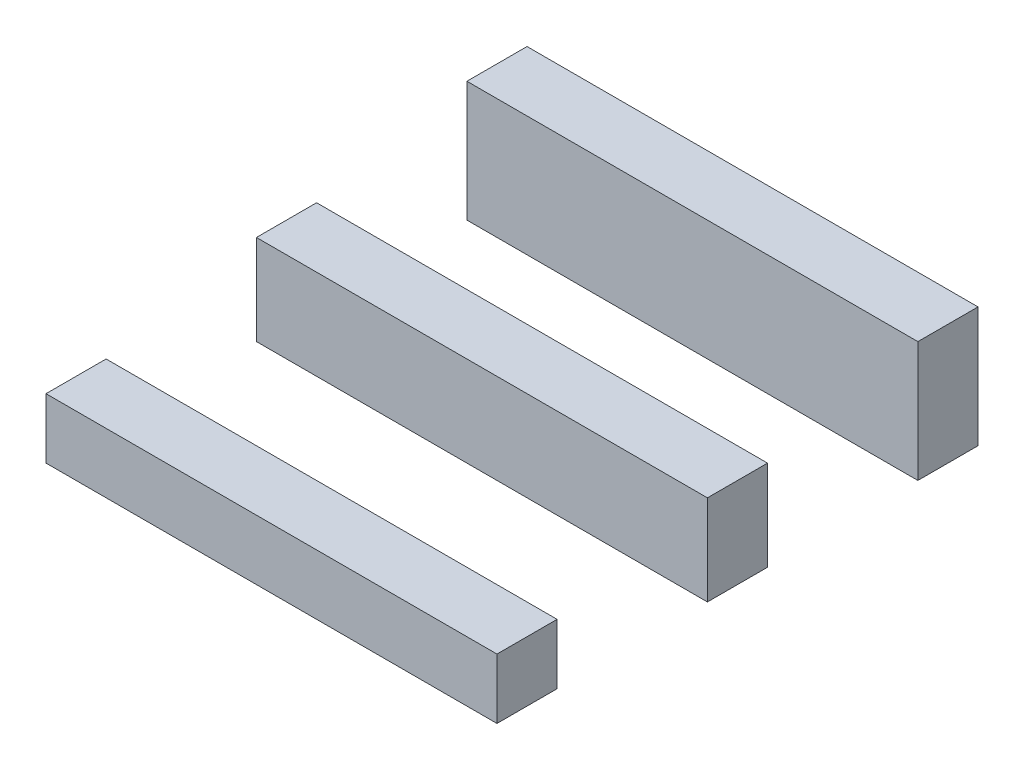
ISO-10303-21;
HEADER;
FILE_DESCRIPTION(('STEP AP214'),'2;1');
FILE_NAME('part.step','',(''),(''),'','','');
FILE_SCHEMA(('AUTOMOTIVE_DESIGN { 1 0 10303 214 1 1 1 1 }'));
ENDSEC;
DATA;
#1=APPLICATION_CONTEXT('core data for automotive mechanical design processes');
#2=APPLICATION_PROTOCOL_DEFINITION('international standard','automotive_design',2000,#1);
#3=PRODUCT_CONTEXT('',#1,'mechanical');
#4=PRODUCT('Part','Part','',(#3));
#5=PRODUCT_RELATED_PRODUCT_CATEGORY('part','',(#4));
#6=PRODUCT_DEFINITION_FORMATION('','',#4);
#7=PRODUCT_DEFINITION_CONTEXT('part definition',#1,'design');
#8=PRODUCT_DEFINITION('design','',#6,#7);
#9=PRODUCT_DEFINITION_SHAPE('','',#8);
#10=(LENGTH_UNIT() NAMED_UNIT(*) SI_UNIT(.MILLI.,.METRE.));
#11=(NAMED_UNIT(*) PLANE_ANGLE_UNIT() SI_UNIT($,.RADIAN.));
#12=(NAMED_UNIT(*) SI_UNIT($,.STERADIAN.) SOLID_ANGLE_UNIT());
#13=UNCERTAINTY_MEASURE_WITH_UNIT(LENGTH_MEASURE(1.E-05),#10,'distance_accuracy_value','');
#14=(GEOMETRIC_REPRESENTATION_CONTEXT(3) GLOBAL_UNCERTAINTY_ASSIGNED_CONTEXT((#13)) GLOBAL_UNIT_ASSIGNED_CONTEXT((#10,
#11,#12)) REPRESENTATION_CONTEXT('',''));
#15=CARTESIAN_POINT('',(0.,0.,0.));
#16=DIRECTION('',(0.,0.,1.));
#17=DIRECTION('',(1.,0.,0.));
#18=AXIS2_PLACEMENT_3D('',#15,#16,#17);
#19=CARTESIAN_POINT('',(-15.,9.,-16.));
#20=DIRECTION('',(1.,0.,0.));
#21=DIRECTION('',(0.,0.,-1.));
#22=AXIS2_PLACEMENT_3D('',#19,#20,#21);
#23=PLANE('',#22);
#24=DIRECTION('',(0.,0.,1.));
#25=VECTOR('',#24,1.);
#26=CARTESIAN_POINT('',(-15.,1.,-16.));
#27=LINE('',#26,#25);
#28=CARTESIAN_POINT('',(-15.,1.,-16.));
#29=VERTEX_POINT('',#28);
#30=CARTESIAN_POINT('',(-15.,1.,-12.));
#31=VERTEX_POINT('',#30);
#32=EDGE_CURVE('E107',#29,#31,#27,.T.);
#33=ORIENTED_EDGE('',*,*,#32,.T.);
#34=DIRECTION('',(0.,-1.,0.));
#35=VECTOR('',#34,1.);
#36=CARTESIAN_POINT('',(-15.,9.,-12.));
#37=LINE('',#36,#35);
#38=CARTESIAN_POINT('',(-15.,9.,-12.));
#39=VERTEX_POINT('',#38);
#40=EDGE_CURVE('E12',#39,#31,#37,.T.);
#41=ORIENTED_EDGE('',*,*,#40,.F.);
#42=DIRECTION('',(0.,0.,1.));
#43=VECTOR('',#42,1.);
#44=CARTESIAN_POINT('',(-15.,9.,-16.));
#45=LINE('',#44,#43);
#46=CARTESIAN_POINT('',(-15.,9.,-16.));
#47=VERTEX_POINT('',#46);
#48=EDGE_CURVE('E95',#47,#39,#45,.T.);
#49=ORIENTED_EDGE('',*,*,#48,.F.);
#50=DIRECTION('',(0.,-1.,0.));
#51=VECTOR('',#50,1.);
#52=CARTESIAN_POINT('',(-15.,9.,-16.));
#53=LINE('',#52,#51);
#54=EDGE_CURVE('E103',#47,#29,#53,.T.);
#55=ORIENTED_EDGE('',*,*,#54,.T.);
#56=EDGE_LOOP('',(#33,#41,#49,#55));
#57=FACE_BOUND('',#56,.T.);
#58=ADVANCED_FACE('F44',(#57),#23,.F.);
#59=CARTESIAN_POINT('',(-15.,9.,-12.));
#60=DIRECTION('',(0.,0.,-1.));
#61=DIRECTION('',(-1.,0.,0.));
#62=AXIS2_PLACEMENT_3D('',#59,#60,#61);
#63=PLANE('',#62);
#64=DIRECTION('',(1.,0.,0.));
#65=VECTOR('',#64,1.);
#66=CARTESIAN_POINT('',(-15.,1.,-12.));
#67=LINE('',#66,#65);
#68=CARTESIAN_POINT('',(15.,1.,-12.));
#69=VERTEX_POINT('',#68);
#70=EDGE_CURVE('E99',#31,#69,#67,.T.);
#71=ORIENTED_EDGE('',*,*,#70,.T.);
#72=DIRECTION('',(0.,-1.,0.));
#73=VECTOR('',#72,1.);
#74=CARTESIAN_POINT('',(15.,9.,-12.));
#75=LINE('',#74,#73);
#76=CARTESIAN_POINT('',(15.,9.,-12.));
#77=VERTEX_POINT('',#76);
#78=EDGE_CURVE('E52',#77,#69,#75,.T.);
#79=ORIENTED_EDGE('',*,*,#78,.F.);
#80=DIRECTION('',(1.,0.,0.));
#81=VECTOR('',#80,1.);
#82=CARTESIAN_POINT('',(-15.,9.,-12.));
#83=LINE('',#82,#81);
#84=EDGE_CURVE('E90',#39,#77,#83,.T.);
#85=ORIENTED_EDGE('',*,*,#84,.F.);
#86=ORIENTED_EDGE('',*,*,#40,.T.);
#87=EDGE_LOOP('',(#71,#79,#85,#86));
#88=FACE_BOUND('',#87,.T.);
#89=ADVANCED_FACE('F98',(#88),#63,.F.);
#90=CARTESIAN_POINT('',(15.,9.,-16.));
#91=DIRECTION('',(-1.,0.,0.));
#92=DIRECTION('',(0.,0.,1.));
#93=AXIS2_PLACEMENT_3D('',#90,#91,#92);
#94=PLANE('',#93);
#95=DIRECTION('',(0.,0.,-1.));
#96=VECTOR('',#95,1.);
#97=CARTESIAN_POINT('',(15.,1.,-16.));
#98=LINE('',#97,#96);
#99=CARTESIAN_POINT('',(15.,1.,-16.));
#100=VERTEX_POINT('',#99);
#101=EDGE_CURVE('E77',#69,#100,#98,.T.);
#102=ORIENTED_EDGE('',*,*,#101,.T.);
#103=DIRECTION('',(0.,-1.,0.));
#104=VECTOR('',#103,1.);
#105=CARTESIAN_POINT('',(15.,9.,-16.));
#106=LINE('',#105,#104);
#107=CARTESIAN_POINT('',(15.,9.,-16.));
#108=VERTEX_POINT('',#107);
#109=EDGE_CURVE('E100',#108,#100,#106,.T.);
#110=ORIENTED_EDGE('',*,*,#109,.F.);
#111=DIRECTION('',(0.,0.,-1.));
#112=VECTOR('',#111,1.);
#113=CARTESIAN_POINT('',(15.,9.,-16.));
#114=LINE('',#113,#112);
#115=EDGE_CURVE('E93',#77,#108,#114,.T.);
#116=ORIENTED_EDGE('',*,*,#115,.F.);
#117=ORIENTED_EDGE('',*,*,#78,.T.);
#118=EDGE_LOOP('',(#102,#110,#116,#117));
#119=FACE_BOUND('',#118,.T.);
#120=ADVANCED_FACE('F101',(#119),#94,.F.);
#121=CARTESIAN_POINT('',(-15.,9.,-16.));
#122=DIRECTION('',(0.,0.,1.));
#123=DIRECTION('',(1.,0.,0.));
#124=AXIS2_PLACEMENT_3D('',#121,#122,#123);
#125=PLANE('',#124);
#126=DIRECTION('',(-1.,0.,0.));
#127=VECTOR('',#126,1.);
#128=CARTESIAN_POINT('',(-15.,1.,-16.));
#129=LINE('',#128,#127);
#130=EDGE_CURVE('E83',#100,#29,#129,.T.);
#131=ORIENTED_EDGE('',*,*,#130,.T.);
#132=ORIENTED_EDGE('',*,*,#54,.F.);
#133=DIRECTION('',(-1.,0.,0.));
#134=VECTOR('',#133,1.);
#135=CARTESIAN_POINT('',(-15.,9.,-16.));
#136=LINE('',#135,#134);
#137=EDGE_CURVE('E60',#108,#47,#136,.T.);
#138=ORIENTED_EDGE('',*,*,#137,.F.);
#139=ORIENTED_EDGE('',*,*,#109,.T.);
#140=EDGE_LOOP('',(#131,#132,#138,#139));
#141=FACE_BOUND('',#140,.T.);
#142=ADVANCED_FACE('F114',(#141),#125,.F.);
#143=CARTESIAN_POINT('',(0.,9.,0.));
#144=DIRECTION('',(0.,1.,0.));
#145=DIRECTION('',(0.,0.,1.));
#146=AXIS2_PLACEMENT_3D('',#143,#144,#145);
#147=PLANE('',#146);
#148=ORIENTED_EDGE('',*,*,#48,.T.);
#149=ORIENTED_EDGE('',*,*,#84,.T.);
#150=ORIENTED_EDGE('',*,*,#115,.T.);
#151=ORIENTED_EDGE('',*,*,#137,.T.);
#152=EDGE_LOOP('',(#148,#149,#150,#151));
#153=FACE_BOUND('',#152,.T.);
#154=ADVANCED_FACE('F91',(#153),#147,.T.);
#155=CARTESIAN_POINT('',(0.,1.,0.));
#156=DIRECTION('',(0.,1.,0.));
#157=DIRECTION('',(0.,0.,1.));
#158=AXIS2_PLACEMENT_3D('',#155,#156,#157);
#159=PLANE('',#158);
#160=ORIENTED_EDGE('',*,*,#32,.F.);
#161=ORIENTED_EDGE('',*,*,#130,.F.);
#162=ORIENTED_EDGE('',*,*,#101,.F.);
#163=ORIENTED_EDGE('',*,*,#70,.F.);
#164=EDGE_LOOP('',(#160,#161,#162,#163));
#165=FACE_BOUND('',#164,.T.);
#166=ADVANCED_FACE('F117',(#165),#159,.F.);
#167=CLOSED_SHELL('',(#58,#89,#120,#142,#154,#166));
#168=MANIFOLD_SOLID_BREP('B2',#167);
#169=CARTESIAN_POINT('',(-15.,7.,-2.00000000000002));
#170=DIRECTION('',(1.,0.,0.));
#171=DIRECTION('',(0.,0.,-1.));
#172=AXIS2_PLACEMENT_3D('',#169,#170,#171);
#173=PLANE('',#172);
#174=DIRECTION('',(0.,0.,1.));
#175=VECTOR('',#174,1.);
#176=CARTESIAN_POINT('',(-15.,1.,-2.00000000000002));
#177=LINE('',#176,#175);
#178=CARTESIAN_POINT('',(-15.,1.,-2.00000000000002));
#179=VERTEX_POINT('',#178);
#180=CARTESIAN_POINT('',(-15.,1.,1.99999999999998));
#181=VERTEX_POINT('',#180);
#182=EDGE_CURVE('E240',#179,#181,#177,.T.);
#183=ORIENTED_EDGE('',*,*,#182,.T.);
#184=DIRECTION('',(0.,-1.,0.));
#185=VECTOR('',#184,1.);
#186=CARTESIAN_POINT('',(-15.,7.,1.99999999999998));
#187=LINE('',#186,#185);
#188=CARTESIAN_POINT('',(-15.,7.,1.99999999999998));
#189=VERTEX_POINT('',#188);
#190=EDGE_CURVE('E42',#189,#181,#187,.T.);
#191=ORIENTED_EDGE('',*,*,#190,.F.);
#192=DIRECTION('',(0.,0.,1.));
#193=VECTOR('',#192,1.);
#194=CARTESIAN_POINT('',(-15.,7.,-2.00000000000002));
#195=LINE('',#194,#193);
#196=CARTESIAN_POINT('',(-15.,7.,-2.00000000000002));
#197=VERTEX_POINT('',#196);
#198=EDGE_CURVE('E228',#197,#189,#195,.T.);
#199=ORIENTED_EDGE('',*,*,#198,.F.);
#200=DIRECTION('',(0.,-1.,0.));
#201=VECTOR('',#200,1.);
#202=CARTESIAN_POINT('',(-15.,7.,-2.00000000000002));
#203=LINE('',#202,#201);
#204=EDGE_CURVE('E236',#197,#179,#203,.T.);
#205=ORIENTED_EDGE('',*,*,#204,.T.);
#206=EDGE_LOOP('',(#183,#191,#199,#205));
#207=FACE_BOUND('',#206,.T.);
#208=ADVANCED_FACE('F177',(#207),#173,.F.);
#209=CARTESIAN_POINT('',(-15.,7.,1.99999999999998));
#210=DIRECTION('',(0.,0.,-1.));
#211=DIRECTION('',(-1.,0.,0.));
#212=AXIS2_PLACEMENT_3D('',#209,#210,#211);
#213=PLANE('',#212);
#214=DIRECTION('',(1.,0.,0.));
#215=VECTOR('',#214,1.);
#216=CARTESIAN_POINT('',(-15.,1.,1.99999999999998));
#217=LINE('',#216,#215);
#218=CARTESIAN_POINT('',(15.,1.,1.99999999999998));
#219=VERTEX_POINT('',#218);
#220=EDGE_CURVE('E232',#181,#219,#217,.T.);
#221=ORIENTED_EDGE('',*,*,#220,.T.);
#222=DIRECTION('',(0.,-1.,0.));
#223=VECTOR('',#222,1.);
#224=CARTESIAN_POINT('',(15.,7.,1.99999999999998));
#225=LINE('',#224,#223);
#226=CARTESIAN_POINT('',(15.,7.,1.99999999999998));
#227=VERTEX_POINT('',#226);
#228=EDGE_CURVE('E185',#227,#219,#225,.T.);
#229=ORIENTED_EDGE('',*,*,#228,.F.);
#230=DIRECTION('',(1.,0.,0.));
#231=VECTOR('',#230,1.);
#232=CARTESIAN_POINT('',(-15.,7.,1.99999999999998));
#233=LINE('',#232,#231);
#234=EDGE_CURVE('E223',#189,#227,#233,.T.);
#235=ORIENTED_EDGE('',*,*,#234,.F.);
#236=ORIENTED_EDGE('',*,*,#190,.T.);
#237=EDGE_LOOP('',(#221,#229,#235,#236));
#238=FACE_BOUND('',#237,.T.);
#239=ADVANCED_FACE('F231',(#238),#213,.F.);
#240=CARTESIAN_POINT('',(15.,7.,-2.00000000000002));
#241=DIRECTION('',(-1.,0.,0.));
#242=DIRECTION('',(0.,0.,1.));
#243=AXIS2_PLACEMENT_3D('',#240,#241,#242);
#244=PLANE('',#243);
#245=DIRECTION('',(0.,0.,-1.));
#246=VECTOR('',#245,1.);
#247=CARTESIAN_POINT('',(15.,1.,-2.00000000000002));
#248=LINE('',#247,#246);
#249=CARTESIAN_POINT('',(15.,1.,-2.00000000000002));
#250=VERTEX_POINT('',#249);
#251=EDGE_CURVE('E210',#219,#250,#248,.T.);
#252=ORIENTED_EDGE('',*,*,#251,.T.);
#253=DIRECTION('',(0.,-1.,0.));
#254=VECTOR('',#253,1.);
#255=CARTESIAN_POINT('',(15.,7.,-2.00000000000002));
#256=LINE('',#255,#254);
#257=CARTESIAN_POINT('',(15.,7.,-2.00000000000002));
#258=VERTEX_POINT('',#257);
#259=EDGE_CURVE('E233',#258,#250,#256,.T.);
#260=ORIENTED_EDGE('',*,*,#259,.F.);
#261=DIRECTION('',(0.,0.,-1.));
#262=VECTOR('',#261,1.);
#263=CARTESIAN_POINT('',(15.,7.,-2.00000000000002));
#264=LINE('',#263,#262);
#265=EDGE_CURVE('E226',#227,#258,#264,.T.);
#266=ORIENTED_EDGE('',*,*,#265,.F.);
#267=ORIENTED_EDGE('',*,*,#228,.T.);
#268=EDGE_LOOP('',(#252,#260,#266,#267));
#269=FACE_BOUND('',#268,.T.);
#270=ADVANCED_FACE('F234',(#269),#244,.F.);
#271=CARTESIAN_POINT('',(-15.,7.,-2.00000000000002));
#272=DIRECTION('',(0.,0.,1.));
#273=DIRECTION('',(1.,0.,0.));
#274=AXIS2_PLACEMENT_3D('',#271,#272,#273);
#275=PLANE('',#274);
#276=DIRECTION('',(-1.,0.,0.));
#277=VECTOR('',#276,1.);
#278=CARTESIAN_POINT('',(-15.,1.,-2.00000000000002));
#279=LINE('',#278,#277);
#280=EDGE_CURVE('E216',#250,#179,#279,.T.);
#281=ORIENTED_EDGE('',*,*,#280,.T.);
#282=ORIENTED_EDGE('',*,*,#204,.F.);
#283=DIRECTION('',(-1.,0.,0.));
#284=VECTOR('',#283,1.);
#285=CARTESIAN_POINT('',(-15.,7.,-2.00000000000002));
#286=LINE('',#285,#284);
#287=EDGE_CURVE('E193',#258,#197,#286,.T.);
#288=ORIENTED_EDGE('',*,*,#287,.F.);
#289=ORIENTED_EDGE('',*,*,#259,.T.);
#290=EDGE_LOOP('',(#281,#282,#288,#289));
#291=FACE_BOUND('',#290,.T.);
#292=ADVANCED_FACE('F247',(#291),#275,.F.);
#293=CARTESIAN_POINT('',(0.,7.,0.));
#294=DIRECTION('',(0.,1.,0.));
#295=DIRECTION('',(0.,0.,1.));
#296=AXIS2_PLACEMENT_3D('',#293,#294,#295);
#297=PLANE('',#296);
#298=ORIENTED_EDGE('',*,*,#198,.T.);
#299=ORIENTED_EDGE('',*,*,#234,.T.);
#300=ORIENTED_EDGE('',*,*,#265,.T.);
#301=ORIENTED_EDGE('',*,*,#287,.T.);
#302=EDGE_LOOP('',(#298,#299,#300,#301));
#303=FACE_BOUND('',#302,.T.);
#304=ADVANCED_FACE('F224',(#303),#297,.T.);
#305=CARTESIAN_POINT('',(0.,1.,0.));
#306=DIRECTION('',(0.,1.,0.));
#307=DIRECTION('',(0.,0.,1.));
#308=AXIS2_PLACEMENT_3D('',#305,#306,#307);
#309=PLANE('',#308);
#310=ORIENTED_EDGE('',*,*,#182,.F.);
#311=ORIENTED_EDGE('',*,*,#280,.F.);
#312=ORIENTED_EDGE('',*,*,#251,.F.);
#313=ORIENTED_EDGE('',*,*,#220,.F.);
#314=EDGE_LOOP('',(#310,#311,#312,#313));
#315=FACE_BOUND('',#314,.T.);
#316=ADVANCED_FACE('F250',(#315),#309,.F.);
#317=CLOSED_SHELL('',(#208,#239,#270,#292,#304,#316));
#318=MANIFOLD_SOLID_BREP('B6',#317);
#319=CARTESIAN_POINT('',(-15.,5.,12.));
#320=DIRECTION('',(1.,0.,0.));
#321=DIRECTION('',(0.,0.,-1.));
#322=AXIS2_PLACEMENT_3D('',#319,#320,#321);
#323=PLANE('',#322);
#324=DIRECTION('',(0.,0.,1.));
#325=VECTOR('',#324,1.);
#326=CARTESIAN_POINT('',(-15.,1.,12.));
#327=LINE('',#326,#325);
#328=CARTESIAN_POINT('',(-15.,1.,12.));
#329=VERTEX_POINT('',#328);
#330=CARTESIAN_POINT('',(-15.,1.,16.));
#331=VERTEX_POINT('',#330);
#332=EDGE_CURVE('E364',#329,#331,#327,.T.);
#333=ORIENTED_EDGE('',*,*,#332,.T.);
#334=DIRECTION('',(0.,-1.,0.));
#335=VECTOR('',#334,1.);
#336=CARTESIAN_POINT('',(-15.,5.,16.));
#337=LINE('',#336,#335);
#338=CARTESIAN_POINT('',(-15.,5.,16.));
#339=VERTEX_POINT('',#338);
#340=EDGE_CURVE('E175',#339,#331,#337,.T.);
#341=ORIENTED_EDGE('',*,*,#340,.F.);
#342=DIRECTION('',(0.,0.,1.));
#343=VECTOR('',#342,1.);
#344=CARTESIAN_POINT('',(-15.,5.,12.));
#345=LINE('',#344,#343);
#346=CARTESIAN_POINT('',(-15.,5.,12.));
#347=VERTEX_POINT('',#346);
#348=EDGE_CURVE('E352',#347,#339,#345,.T.);
#349=ORIENTED_EDGE('',*,*,#348,.F.);
#350=DIRECTION('',(0.,-1.,0.));
#351=VECTOR('',#350,1.);
#352=CARTESIAN_POINT('',(-15.,5.,12.));
#353=LINE('',#352,#351);
#354=EDGE_CURVE('E360',#347,#329,#353,.T.);
#355=ORIENTED_EDGE('',*,*,#354,.T.);
#356=EDGE_LOOP('',(#333,#341,#349,#355));
#357=FACE_BOUND('',#356,.T.);
#358=ADVANCED_FACE('F301',(#357),#323,.F.);
#359=CARTESIAN_POINT('',(-15.,5.,16.));
#360=DIRECTION('',(0.,0.,-1.));
#361=DIRECTION('',(-1.,0.,0.));
#362=AXIS2_PLACEMENT_3D('',#359,#360,#361);
#363=PLANE('',#362);
#364=DIRECTION('',(1.,0.,0.));
#365=VECTOR('',#364,1.);
#366=CARTESIAN_POINT('',(-15.,1.,16.));
#367=LINE('',#366,#365);
#368=CARTESIAN_POINT('',(15.,1.,16.));
#369=VERTEX_POINT('',#368);
#370=EDGE_CURVE('E356',#331,#369,#367,.T.);
#371=ORIENTED_EDGE('',*,*,#370,.T.);
#372=DIRECTION('',(0.,-1.,0.));
#373=VECTOR('',#372,1.);
#374=CARTESIAN_POINT('',(15.,5.,16.));
#375=LINE('',#374,#373);
#376=CARTESIAN_POINT('',(15.,5.,16.));
#377=VERTEX_POINT('',#376);
#378=EDGE_CURVE('E309',#377,#369,#375,.T.);
#379=ORIENTED_EDGE('',*,*,#378,.F.);
#380=DIRECTION('',(1.,0.,0.));
#381=VECTOR('',#380,1.);
#382=CARTESIAN_POINT('',(-15.,5.,16.));
#383=LINE('',#382,#381);
#384=EDGE_CURVE('E347',#339,#377,#383,.T.);
#385=ORIENTED_EDGE('',*,*,#384,.F.);
#386=ORIENTED_EDGE('',*,*,#340,.T.);
#387=EDGE_LOOP('',(#371,#379,#385,#386));
#388=FACE_BOUND('',#387,.T.);
#389=ADVANCED_FACE('F355',(#388),#363,.F.);
#390=CARTESIAN_POINT('',(15.,5.,12.));
#391=DIRECTION('',(-1.,0.,0.));
#392=DIRECTION('',(0.,0.,1.));
#393=AXIS2_PLACEMENT_3D('',#390,#391,#392);
#394=PLANE('',#393);
#395=DIRECTION('',(0.,0.,-1.));
#396=VECTOR('',#395,1.);
#397=CARTESIAN_POINT('',(15.,1.,12.));
#398=LINE('',#397,#396);
#399=CARTESIAN_POINT('',(15.,1.,12.));
#400=VERTEX_POINT('',#399);
#401=EDGE_CURVE('E334',#369,#400,#398,.T.);
#402=ORIENTED_EDGE('',*,*,#401,.T.);
#403=DIRECTION('',(0.,-1.,0.));
#404=VECTOR('',#403,1.);
#405=CARTESIAN_POINT('',(15.,5.,12.));
#406=LINE('',#405,#404);
#407=CARTESIAN_POINT('',(15.,5.,12.));
#408=VERTEX_POINT('',#407);
#409=EDGE_CURVE('E357',#408,#400,#406,.T.);
#410=ORIENTED_EDGE('',*,*,#409,.F.);
#411=DIRECTION('',(0.,0.,-1.));
#412=VECTOR('',#411,1.);
#413=CARTESIAN_POINT('',(15.,5.,12.));
#414=LINE('',#413,#412);
#415=EDGE_CURVE('E350',#377,#408,#414,.T.);
#416=ORIENTED_EDGE('',*,*,#415,.F.);
#417=ORIENTED_EDGE('',*,*,#378,.T.);
#418=EDGE_LOOP('',(#402,#410,#416,#417));
#419=FACE_BOUND('',#418,.T.);
#420=ADVANCED_FACE('F358',(#419),#394,.F.);
#421=CARTESIAN_POINT('',(-15.,5.,12.));
#422=DIRECTION('',(0.,0.,1.));
#423=DIRECTION('',(1.,0.,0.));
#424=AXIS2_PLACEMENT_3D('',#421,#422,#423);
#425=PLANE('',#424);
#426=DIRECTION('',(-1.,0.,0.));
#427=VECTOR('',#426,1.);
#428=CARTESIAN_POINT('',(-15.,1.,12.));
#429=LINE('',#428,#427);
#430=EDGE_CURVE('E340',#400,#329,#429,.T.);
#431=ORIENTED_EDGE('',*,*,#430,.T.);
#432=ORIENTED_EDGE('',*,*,#354,.F.);
#433=DIRECTION('',(-1.,0.,0.));
#434=VECTOR('',#433,1.);
#435=CARTESIAN_POINT('',(-15.,5.,12.));
#436=LINE('',#435,#434);
#437=EDGE_CURVE('E317',#408,#347,#436,.T.);
#438=ORIENTED_EDGE('',*,*,#437,.F.);
#439=ORIENTED_EDGE('',*,*,#409,.T.);
#440=EDGE_LOOP('',(#431,#432,#438,#439));
#441=FACE_BOUND('',#440,.T.);
#442=ADVANCED_FACE('F371',(#441),#425,.F.);
#443=CARTESIAN_POINT('',(0.,5.,0.));
#444=DIRECTION('',(0.,1.,0.));
#445=DIRECTION('',(0.,0.,1.));
#446=AXIS2_PLACEMENT_3D('',#443,#444,#445);
#447=PLANE('',#446);
#448=ORIENTED_EDGE('',*,*,#348,.T.);
#449=ORIENTED_EDGE('',*,*,#384,.T.);
#450=ORIENTED_EDGE('',*,*,#415,.T.);
#451=ORIENTED_EDGE('',*,*,#437,.T.);
#452=EDGE_LOOP('',(#448,#449,#450,#451));
#453=FACE_BOUND('',#452,.T.);
#454=ADVANCED_FACE('F348',(#453),#447,.T.);
#455=CARTESIAN_POINT('',(0.,1.,0.));
#456=DIRECTION('',(0.,1.,0.));
#457=DIRECTION('',(0.,0.,1.));
#458=AXIS2_PLACEMENT_3D('',#455,#456,#457);
#459=PLANE('',#458);
#460=ORIENTED_EDGE('',*,*,#332,.F.);
#461=ORIENTED_EDGE('',*,*,#430,.F.);
#462=ORIENTED_EDGE('',*,*,#401,.F.);
#463=ORIENTED_EDGE('',*,*,#370,.F.);
#464=EDGE_LOOP('',(#460,#461,#462,#463));
#465=FACE_BOUND('',#464,.T.);
#466=ADVANCED_FACE('F374',(#465),#459,.F.);
#467=CLOSED_SHELL('',(#358,#389,#420,#442,#454,#466));
#468=MANIFOLD_SOLID_BREP('B36',#467);
#469=ADVANCED_BREP_SHAPE_REPRESENTATION('',(#18,#168,#318,#468),#14);
#470=SHAPE_DEFINITION_REPRESENTATION(#9,#469);
ENDSEC;
END-ISO-10303-21;
